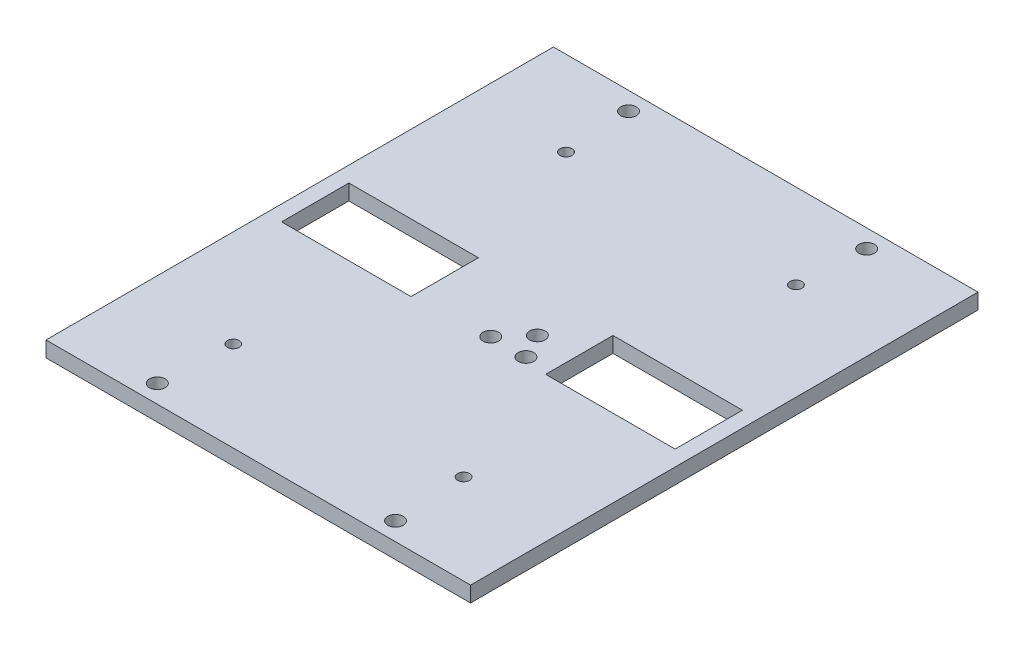
ISO-10303-21;
HEADER;
FILE_DESCRIPTION(('STEP AP214'),'2;1');
FILE_NAME('part.step','',(''),(''),'','','');
FILE_SCHEMA(('AUTOMOTIVE_DESIGN { 1 0 10303 214 1 1 1 1 }'));
ENDSEC;
DATA;
#1=APPLICATION_CONTEXT('core data for automotive mechanical design processes');
#2=APPLICATION_PROTOCOL_DEFINITION('international standard','automotive_design',2000,#1);
#3=PRODUCT_CONTEXT('',#1,'mechanical');
#4=PRODUCT('Part','Part','',(#3));
#5=PRODUCT_RELATED_PRODUCT_CATEGORY('part','',(#4));
#6=PRODUCT_DEFINITION_FORMATION('','',#4);
#7=PRODUCT_DEFINITION_CONTEXT('part definition',#1,'design');
#8=PRODUCT_DEFINITION('design','',#6,#7);
#9=PRODUCT_DEFINITION_SHAPE('','',#8);
#10=(LENGTH_UNIT() NAMED_UNIT(*) SI_UNIT(.MILLI.,.METRE.));
#11=(NAMED_UNIT(*) PLANE_ANGLE_UNIT() SI_UNIT($,.RADIAN.));
#12=(NAMED_UNIT(*) SI_UNIT($,.STERADIAN.) SOLID_ANGLE_UNIT());
#13=UNCERTAINTY_MEASURE_WITH_UNIT(LENGTH_MEASURE(1.E-05),#10,'distance_accuracy_value','');
#14=(GEOMETRIC_REPRESENTATION_CONTEXT(3) GLOBAL_UNCERTAINTY_ASSIGNED_CONTEXT((#13)) GLOBAL_UNIT_ASSIGNED_CONTEXT((#10,
#11,#12)) REPRESENTATION_CONTEXT('',''));
#15=CARTESIAN_POINT('',(0.,0.,0.));
#16=DIRECTION('',(0.,0.,1.));
#17=DIRECTION('',(1.,0.,0.));
#18=AXIS2_PLACEMENT_3D('',#15,#16,#17);
#19=CARTESIAN_POINT('',(-41.,3.,49.));
#20=DIRECTION('',(1.,0.,0.));
#21=DIRECTION('',(0.,0.,-1.));
#22=AXIS2_PLACEMENT_3D('',#19,#20,#21);
#23=PLANE('',#22);
#24=DIRECTION('',(0.,0.,1.));
#25=VECTOR('',#24,1.);
#26=CARTESIAN_POINT('',(-41.,0.,49.));
#27=LINE('',#26,#25);
#28=CARTESIAN_POINT('',(-41.,0.,-49.));
#29=VERTEX_POINT('',#28);
#30=CARTESIAN_POINT('',(-41.,0.,49.));
#31=VERTEX_POINT('',#30);
#32=EDGE_CURVE('E212',#29,#31,#27,.T.);
#33=ORIENTED_EDGE('',*,*,#32,.T.);
#34=DIRECTION('',(0.,-1.,0.));
#35=VECTOR('',#34,1.);
#36=CARTESIAN_POINT('',(-41.,3.,49.));
#37=LINE('',#36,#35);
#38=CARTESIAN_POINT('',(-41.,3.,49.));
#39=VERTEX_POINT('',#38);
#40=EDGE_CURVE('E11',#39,#31,#37,.T.);
#41=ORIENTED_EDGE('',*,*,#40,.F.);
#42=DIRECTION('',(0.,0.,1.));
#43=VECTOR('',#42,1.);
#44=CARTESIAN_POINT('',(-41.,3.,49.));
#45=LINE('',#44,#43);
#46=CARTESIAN_POINT('',(-41.,3.,-49.));
#47=VERTEX_POINT('',#46);
#48=EDGE_CURVE('E213',#47,#39,#45,.T.);
#49=ORIENTED_EDGE('',*,*,#48,.F.);
#50=DIRECTION('',(0.,-1.,0.));
#51=VECTOR('',#50,1.);
#52=CARTESIAN_POINT('',(-41.,3.,-49.));
#53=LINE('',#52,#51);
#54=EDGE_CURVE('E223',#47,#29,#53,.T.);
#55=ORIENTED_EDGE('',*,*,#54,.T.);
#56=EDGE_LOOP('',(#33,#41,#49,#55));
#57=FACE_BOUND('',#56,.T.);
#58=ADVANCED_FACE('F34',(#57),#23,.F.);
#59=CARTESIAN_POINT('',(41.,3.,49.));
#60=DIRECTION('',(0.,0.,-1.));
#61=DIRECTION('',(-1.,0.,0.));
#62=AXIS2_PLACEMENT_3D('',#59,#60,#61);
#63=PLANE('',#62);
#64=DIRECTION('',(1.,0.,0.));
#65=VECTOR('',#64,1.);
#66=CARTESIAN_POINT('',(41.,0.,49.));
#67=LINE('',#66,#65);
#68=CARTESIAN_POINT('',(41.,0.,49.));
#69=VERTEX_POINT('',#68);
#70=EDGE_CURVE('E226',#31,#69,#67,.T.);
#71=ORIENTED_EDGE('',*,*,#70,.T.);
#72=DIRECTION('',(0.,-1.,0.));
#73=VECTOR('',#72,1.);
#74=CARTESIAN_POINT('',(41.,3.,49.));
#75=LINE('',#74,#73);
#76=CARTESIAN_POINT('',(41.,3.,49.));
#77=VERTEX_POINT('',#76);
#78=EDGE_CURVE('E42',#77,#69,#75,.T.);
#79=ORIENTED_EDGE('',*,*,#78,.F.);
#80=DIRECTION('',(1.,0.,0.));
#81=VECTOR('',#80,1.);
#82=CARTESIAN_POINT('',(41.,3.,49.));
#83=LINE('',#82,#81);
#84=EDGE_CURVE('E216',#39,#77,#83,.T.);
#85=ORIENTED_EDGE('',*,*,#84,.F.);
#86=ORIENTED_EDGE('',*,*,#40,.T.);
#87=EDGE_LOOP('',(#71,#79,#85,#86));
#88=FACE_BOUND('',#87,.T.);
#89=ADVANCED_FACE('F280',(#88),#63,.F.);
#90=CARTESIAN_POINT('',(41.,3.,49.));
#91=DIRECTION('',(-1.,0.,0.));
#92=DIRECTION('',(0.,0.,1.));
#93=AXIS2_PLACEMENT_3D('',#90,#91,#92);
#94=PLANE('',#93);
#95=DIRECTION('',(0.,0.,-1.));
#96=VECTOR('',#95,1.);
#97=CARTESIAN_POINT('',(41.,0.,49.));
#98=LINE('',#97,#96);
#99=CARTESIAN_POINT('',(41.,0.,-49.));
#100=VERTEX_POINT('',#99);
#101=EDGE_CURVE('E228',#69,#100,#98,.T.);
#102=ORIENTED_EDGE('',*,*,#101,.T.);
#103=DIRECTION('',(0.,-1.,0.));
#104=VECTOR('',#103,1.);
#105=CARTESIAN_POINT('',(41.,3.,-49.));
#106=LINE('',#105,#104);
#107=CARTESIAN_POINT('',(41.,3.,-49.));
#108=VERTEX_POINT('',#107);
#109=EDGE_CURVE('E233',#108,#100,#106,.T.);
#110=ORIENTED_EDGE('',*,*,#109,.F.);
#111=DIRECTION('',(0.,0.,-1.));
#112=VECTOR('',#111,1.);
#113=CARTESIAN_POINT('',(41.,3.,49.));
#114=LINE('',#113,#112);
#115=EDGE_CURVE('E219',#77,#108,#114,.T.);
#116=ORIENTED_EDGE('',*,*,#115,.F.);
#117=ORIENTED_EDGE('',*,*,#78,.T.);
#118=EDGE_LOOP('',(#102,#110,#116,#117));
#119=FACE_BOUND('',#118,.T.);
#120=ADVANCED_FACE('F285',(#119),#94,.F.);
#121=CARTESIAN_POINT('',(41.,3.,-49.));
#122=DIRECTION('',(0.,0.,1.));
#123=DIRECTION('',(1.,0.,0.));
#124=AXIS2_PLACEMENT_3D('',#121,#122,#123);
#125=PLANE('',#124);
#126=DIRECTION('',(-1.,0.,0.));
#127=VECTOR('',#126,1.);
#128=CARTESIAN_POINT('',(41.,0.,-49.));
#129=LINE('',#128,#127);
#130=EDGE_CURVE('E217',#100,#29,#129,.T.);
#131=ORIENTED_EDGE('',*,*,#130,.T.);
#132=ORIENTED_EDGE('',*,*,#54,.F.);
#133=DIRECTION('',(-1.,0.,0.));
#134=VECTOR('',#133,1.);
#135=CARTESIAN_POINT('',(41.,3.,-49.));
#136=LINE('',#135,#134);
#137=EDGE_CURVE('E221',#108,#47,#136,.T.);
#138=ORIENTED_EDGE('',*,*,#137,.F.);
#139=ORIENTED_EDGE('',*,*,#109,.T.);
#140=EDGE_LOOP('',(#131,#132,#138,#139));
#141=FACE_BOUND('',#140,.T.);
#142=ADVANCED_FACE('F301',(#141),#125,.F.);
#143=CARTESIAN_POINT('',(0.,3.,0.));
#144=DIRECTION('',(0.,1.,0.));
#145=DIRECTION('',(0.,0.,1.));
#146=AXIS2_PLACEMENT_3D('',#143,#144,#145);
#147=PLANE('',#146);
#148=CARTESIAN_POINT('',(1.39999999999996,3.,5.50000000000026));
#149=DIRECTION('',(0.,1.,0.));
#150=DIRECTION('',(0.,0.,1.));
#151=AXIS2_PLACEMENT_3D('',#148,#149,#150);
#152=CIRCLE('',#151,1.5);
#153=CARTESIAN_POINT('',(1.39999999999996,3.,7.00000000000026));
#154=VERTEX_POINT('',#153);
#155=EDGE_CURVE('E476',#154,#154,#152,.T.);
#156=ORIENTED_EDGE('',*,*,#155,.F.);
#157=EDGE_LOOP('',(#156));
#158=FACE_BOUND('',#157,.T.);
#159=CARTESIAN_POINT('',(8.19999999999995,3.,5.50000000000028));
#160=DIRECTION('',(0.,1.,0.));
#161=DIRECTION('',(0.,0.,1.));
#162=AXIS2_PLACEMENT_3D('',#159,#160,#161);
#163=CIRCLE('',#162,1.5);
#164=CARTESIAN_POINT('',(8.19999999999995,3.,7.00000000000028));
#165=VERTEX_POINT('',#164);
#166=EDGE_CURVE('E486',#165,#165,#163,.T.);
#167=ORIENTED_EDGE('',*,*,#166,.F.);
#168=EDGE_LOOP('',(#167));
#169=FACE_BOUND('',#168,.T.);
#170=CARTESIAN_POINT('',(5.69999999999997,3.,0.800000000000266));
#171=DIRECTION('',(0.,1.,0.));
#172=DIRECTION('',(0.,0.,1.));
#173=AXIS2_PLACEMENT_3D('',#170,#171,#172);
#174=CIRCLE('',#173,1.5);
#175=CARTESIAN_POINT('',(5.69999999999997,3.,2.30000000000027));
#176=VERTEX_POINT('',#175);
#177=EDGE_CURVE('E491',#176,#176,#174,.T.);
#178=ORIENTED_EDGE('',*,*,#177,.F.);
#179=EDGE_LOOP('',(#178));
#180=FACE_BOUND('',#179,.T.);
#181=CARTESIAN_POINT('',(-22.2450014404778,3.,31.5907366922285));
#182=DIRECTION('',(0.,1.,0.));
#183=DIRECTION('',(0.,0.,1.));
#184=AXIS2_PLACEMENT_3D('',#181,#182,#183);
#185=CIRCLE('',#184,1.14999999999999);
#186=CARTESIAN_POINT('',(-22.2450014404778,3.,32.7407366922285));
#187=VERTEX_POINT('',#186);
#188=EDGE_CURVE('E254',#187,#187,#185,.T.);
#189=ORIENTED_EDGE('',*,*,#188,.F.);
#190=EDGE_LOOP('',(#189));
#191=FACE_BOUND('',#190,.T.);
#192=CARTESIAN_POINT('',(22.2450014404778,3.,31.5907366922285));
#193=DIRECTION('',(0.,1.,0.));
#194=DIRECTION('',(0.,0.,1.));
#195=AXIS2_PLACEMENT_3D('',#192,#193,#194);
#196=CIRCLE('',#195,1.14999999999999);
#197=CARTESIAN_POINT('',(22.2450014404778,3.,32.7407366922285));
#198=VERTEX_POINT('',#197);
#199=EDGE_CURVE('E244',#198,#198,#196,.T.);
#200=ORIENTED_EDGE('',*,*,#199,.F.);
#201=EDGE_LOOP('',(#200));
#202=FACE_BOUND('',#201,.T.);
#203=CARTESIAN_POINT('',(22.2031172324923,3.,-32.6338065342233));
#204=DIRECTION('',(0.,1.,0.));
#205=DIRECTION('',(0.,0.,1.));
#206=AXIS2_PLACEMENT_3D('',#203,#204,#205);
#207=CIRCLE('',#206,1.14999999999999);
#208=CARTESIAN_POINT('',(22.2031172324923,3.,-31.4838065342233));
#209=VERTEX_POINT('',#208);
#210=EDGE_CURVE('E241',#209,#209,#207,.T.);
#211=ORIENTED_EDGE('',*,*,#210,.F.);
#212=EDGE_LOOP('',(#211));
#213=FACE_BOUND('',#212,.T.);
#214=CARTESIAN_POINT('',(-22.2031172324923,3.,-32.6338065342233));
#215=DIRECTION('',(0.,1.,0.));
#216=DIRECTION('',(0.,0.,1.));
#217=AXIS2_PLACEMENT_3D('',#214,#215,#216);
#218=CIRCLE('',#217,1.14999999999999);
#219=CARTESIAN_POINT('',(-22.2031172324923,3.,-31.4838065342233));
#220=VERTEX_POINT('',#219);
#221=EDGE_CURVE('E240',#220,#220,#218,.T.);
#222=ORIENTED_EDGE('',*,*,#221,.F.);
#223=EDGE_LOOP('',(#222));
#224=FACE_BOUND('',#223,.T.);
#225=DIRECTION('',(0.,0.,1.));
#226=VECTOR('',#225,1.);
#227=CARTESIAN_POINT('',(13.,3.,0.));
#228=LINE('',#227,#226);
#229=CARTESIAN_POINT('',(13.,3.,-6.49999999999975));
#230=VERTEX_POINT('',#229);
#231=CARTESIAN_POINT('',(13.,3.,6.50000000000025));
#232=VERTEX_POINT('',#231);
#233=EDGE_CURVE('E157',#230,#232,#228,.T.);
#234=ORIENTED_EDGE('',*,*,#233,.F.);
#235=DIRECTION('',(-1.,0.,0.));
#236=VECTOR('',#235,1.);
#237=CARTESIAN_POINT('',(0.,3.,-6.49999999999975));
#238=LINE('',#237,#236);
#239=CARTESIAN_POINT('',(38.,3.,-6.49999999999975));
#240=VERTEX_POINT('',#239);
#241=EDGE_CURVE('E150',#240,#230,#238,.T.);
#242=ORIENTED_EDGE('',*,*,#241,.F.);
#243=DIRECTION('',(0.,0.,-1.));
#244=VECTOR('',#243,1.);
#245=CARTESIAN_POINT('',(38.,3.,0.));
#246=LINE('',#245,#244);
#247=CARTESIAN_POINT('',(38.,3.,6.50000000000025));
#248=VERTEX_POINT('',#247);
#249=EDGE_CURVE('E130',#248,#240,#246,.T.);
#250=ORIENTED_EDGE('',*,*,#249,.F.);
#251=DIRECTION('',(1.,0.,0.));
#252=VECTOR('',#251,1.);
#253=CARTESIAN_POINT('',(0.,3.,6.50000000000025));
#254=LINE('',#253,#252);
#255=EDGE_CURVE('E155',#232,#248,#254,.T.);
#256=ORIENTED_EDGE('',*,*,#255,.F.);
#257=EDGE_LOOP('',(#234,#242,#250,#256));
#258=FACE_BOUND('',#257,.T.);
#259=DIRECTION('',(0.,0.,1.));
#260=VECTOR('',#259,1.);
#261=CARTESIAN_POINT('',(-38.,3.,0.));
#262=LINE('',#261,#260);
#263=CARTESIAN_POINT('',(-38.,3.,-6.49999999999975));
#264=VERTEX_POINT('',#263);
#265=CARTESIAN_POINT('',(-38.,3.,6.50000000000025));
#266=VERTEX_POINT('',#265);
#267=EDGE_CURVE('E186',#264,#266,#262,.T.);
#268=ORIENTED_EDGE('',*,*,#267,.F.);
#269=DIRECTION('',(-1.,0.,0.));
#270=VECTOR('',#269,1.);
#271=CARTESIAN_POINT('',(0.,3.,-6.49999999999975));
#272=LINE('',#271,#270);
#273=CARTESIAN_POINT('',(-13.,3.,-6.49999999999975));
#274=VERTEX_POINT('',#273);
#275=EDGE_CURVE('E173',#274,#264,#272,.T.);
#276=ORIENTED_EDGE('',*,*,#275,.F.);
#277=DIRECTION('',(0.,0.,-1.));
#278=VECTOR('',#277,1.);
#279=CARTESIAN_POINT('',(-13.,3.,0.));
#280=LINE('',#279,#278);
#281=CARTESIAN_POINT('',(-13.,3.,6.50000000000025));
#282=VERTEX_POINT('',#281);
#283=EDGE_CURVE('E181',#282,#274,#280,.T.);
#284=ORIENTED_EDGE('',*,*,#283,.F.);
#285=DIRECTION('',(1.,0.,0.));
#286=VECTOR('',#285,1.);
#287=CARTESIAN_POINT('',(0.,3.,6.50000000000025));
#288=LINE('',#287,#286);
#289=EDGE_CURVE('E184',#266,#282,#288,.T.);
#290=ORIENTED_EDGE('',*,*,#289,.F.);
#291=EDGE_LOOP('',(#268,#276,#284,#290));
#292=FACE_BOUND('',#291,.T.);
#293=CARTESIAN_POINT('',(-22.9999999999991,3.,45.5000000000039));
#294=DIRECTION('',(0.,1.,0.));
#295=DIRECTION('',(0.,0.,1.));
#296=AXIS2_PLACEMENT_3D('',#293,#294,#295);
#297=CIRCLE('',#296,1.5);
#298=CARTESIAN_POINT('',(-22.9999999999991,3.,47.0000000000039));
#299=VERTEX_POINT('',#298);
#300=EDGE_CURVE('E191',#299,#299,#297,.T.);
#301=ORIENTED_EDGE('',*,*,#300,.F.);
#302=EDGE_LOOP('',(#301));
#303=FACE_BOUND('',#302,.T.);
#304=CARTESIAN_POINT('',(23.0000000000009,3.,45.5000000000042));
#305=DIRECTION('',(0.,1.,0.));
#306=DIRECTION('',(0.,0.,1.));
#307=AXIS2_PLACEMENT_3D('',#304,#305,#306);
#308=CIRCLE('',#307,1.5);
#309=CARTESIAN_POINT('',(23.0000000000009,3.,47.0000000000042));
#310=VERTEX_POINT('',#309);
#311=EDGE_CURVE('E197',#310,#310,#308,.T.);
#312=ORIENTED_EDGE('',*,*,#311,.F.);
#313=EDGE_LOOP('',(#312));
#314=FACE_BOUND('',#313,.T.);
#315=CARTESIAN_POINT('',(23.0000000000016,3.,-45.4999999999957));
#316=DIRECTION('',(0.,1.,0.));
#317=DIRECTION('',(0.,0.,1.));
#318=AXIS2_PLACEMENT_3D('',#315,#316,#317);
#319=CIRCLE('',#318,1.5);
#320=CARTESIAN_POINT('',(23.0000000000016,3.,-43.9999999999957));
#321=VERTEX_POINT('',#320);
#322=EDGE_CURVE('E203',#321,#321,#319,.T.);
#323=ORIENTED_EDGE('',*,*,#322,.F.);
#324=EDGE_LOOP('',(#323));
#325=FACE_BOUND('',#324,.T.);
#326=CARTESIAN_POINT('',(-22.9999999999984,3.,-45.4999999999961));
#327=DIRECTION('',(0.,1.,0.));
#328=DIRECTION('',(0.,0.,1.));
#329=AXIS2_PLACEMENT_3D('',#326,#327,#328);
#330=CIRCLE('',#329,1.5);
#331=CARTESIAN_POINT('',(-22.9999999999984,3.,-43.9999999999961));
#332=VERTEX_POINT('',#331);
#333=EDGE_CURVE('E209',#332,#332,#330,.T.);
#334=ORIENTED_EDGE('',*,*,#333,.F.);
#335=EDGE_LOOP('',(#334));
#336=FACE_BOUND('',#335,.T.);
#337=ORIENTED_EDGE('',*,*,#48,.T.);
#338=ORIENTED_EDGE('',*,*,#84,.T.);
#339=ORIENTED_EDGE('',*,*,#115,.T.);
#340=ORIENTED_EDGE('',*,*,#137,.T.);
#341=EDGE_LOOP('',(#337,#338,#339,#340));
#342=FACE_BOUND('',#341,.T.);
#343=ADVANCED_FACE('F297',(#158,#169,#180,#191,#202,#213,#224,#258,#292,#303,#314,#325,#336,
#342),#147,.T.);
#344=CARTESIAN_POINT('',(0.,0.,0.));
#345=DIRECTION('',(0.,1.,0.));
#346=DIRECTION('',(0.,0.,1.));
#347=AXIS2_PLACEMENT_3D('',#344,#345,#346);
#348=PLANE('',#347);
#349=CARTESIAN_POINT('',(1.39999999999996,0.,5.50000000000026));
#350=DIRECTION('',(0.,-1.,0.));
#351=DIRECTION('',(0.,0.,-1.));
#352=AXIS2_PLACEMENT_3D('',#349,#350,#351);
#353=CIRCLE('',#352,1.5);
#354=CARTESIAN_POINT('',(1.39999999999996,0.,4.00000000000026));
#355=VERTEX_POINT('',#354);
#356=EDGE_CURVE('E479',#355,#355,#353,.T.);
#357=ORIENTED_EDGE('',*,*,#356,.F.);
#358=EDGE_LOOP('',(#357));
#359=FACE_BOUND('',#358,.T.);
#360=CARTESIAN_POINT('',(8.19999999999995,0.,5.50000000000028));
#361=DIRECTION('',(0.,-1.,0.));
#362=DIRECTION('',(0.,0.,-1.));
#363=AXIS2_PLACEMENT_3D('',#360,#361,#362);
#364=CIRCLE('',#363,1.5);
#365=CARTESIAN_POINT('',(8.19999999999995,0.,4.00000000000028));
#366=VERTEX_POINT('',#365);
#367=EDGE_CURVE('E481',#366,#366,#364,.T.);
#368=ORIENTED_EDGE('',*,*,#367,.F.);
#369=EDGE_LOOP('',(#368));
#370=FACE_BOUND('',#369,.T.);
#371=CARTESIAN_POINT('',(5.69999999999997,0.,0.800000000000266));
#372=DIRECTION('',(0.,-1.,0.));
#373=DIRECTION('',(0.,0.,-1.));
#374=AXIS2_PLACEMENT_3D('',#371,#372,#373);
#375=CIRCLE('',#374,1.5);
#376=CARTESIAN_POINT('',(5.69999999999997,0.,-0.699999999999735));
#377=VERTEX_POINT('',#376);
#378=EDGE_CURVE('E489',#377,#377,#375,.T.);
#379=ORIENTED_EDGE('',*,*,#378,.F.);
#380=EDGE_LOOP('',(#379));
#381=FACE_BOUND('',#380,.T.);
#382=CARTESIAN_POINT('',(-22.2450014404778,0.,31.5907366922285));
#383=DIRECTION('',(0.,1.,0.));
#384=DIRECTION('',(0.,0.,1.));
#385=AXIS2_PLACEMENT_3D('',#382,#383,#384);
#386=CIRCLE('',#385,1.14999999999999);
#387=CARTESIAN_POINT('',(-22.2450014404778,0.,32.7407366922285));
#388=VERTEX_POINT('',#387);
#389=EDGE_CURVE('E37',#388,#388,#386,.T.);
#390=ORIENTED_EDGE('',*,*,#389,.T.);
#391=EDGE_LOOP('',(#390));
#392=FACE_BOUND('',#391,.T.);
#393=CARTESIAN_POINT('',(22.2450014404778,0.,31.5907366922285));
#394=DIRECTION('',(0.,1.,0.));
#395=DIRECTION('',(0.,0.,1.));
#396=AXIS2_PLACEMENT_3D('',#393,#394,#395);
#397=CIRCLE('',#396,1.14999999999999);
#398=CARTESIAN_POINT('',(22.2450014404778,0.,32.7407366922285));
#399=VERTEX_POINT('',#398);
#400=EDGE_CURVE('E242',#399,#399,#397,.T.);
#401=ORIENTED_EDGE('',*,*,#400,.T.);
#402=EDGE_LOOP('',(#401));
#403=FACE_BOUND('',#402,.T.);
#404=CARTESIAN_POINT('',(22.2031172324923,0.,-32.6338065342233));
#405=DIRECTION('',(0.,1.,0.));
#406=DIRECTION('',(0.,0.,1.));
#407=AXIS2_PLACEMENT_3D('',#404,#405,#406);
#408=CIRCLE('',#407,1.14999999999999);
#409=CARTESIAN_POINT('',(22.2031172324923,0.,-31.4838065342233));
#410=VERTEX_POINT('',#409);
#411=EDGE_CURVE('E238',#410,#410,#408,.T.);
#412=ORIENTED_EDGE('',*,*,#411,.T.);
#413=EDGE_LOOP('',(#412));
#414=FACE_BOUND('',#413,.T.);
#415=CARTESIAN_POINT('',(-22.2031172324923,0.,-32.6338065342233));
#416=DIRECTION('',(0.,1.,0.));
#417=DIRECTION('',(0.,0.,1.));
#418=AXIS2_PLACEMENT_3D('',#415,#416,#417);
#419=CIRCLE('',#418,1.14999999999999);
#420=CARTESIAN_POINT('',(-22.2031172324923,0.,-31.4838065342233));
#421=VERTEX_POINT('',#420);
#422=EDGE_CURVE('E260',#421,#421,#419,.T.);
#423=ORIENTED_EDGE('',*,*,#422,.T.);
#424=EDGE_LOOP('',(#423));
#425=FACE_BOUND('',#424,.T.);
#426=DIRECTION('',(1.,0.,0.));
#427=VECTOR('',#426,1.);
#428=CARTESIAN_POINT('',(13.,0.,-6.49999999999975));
#429=LINE('',#428,#427);
#430=CARTESIAN_POINT('',(13.,0.,-6.49999999999975));
#431=VERTEX_POINT('',#430);
#432=CARTESIAN_POINT('',(38.,0.,-6.49999999999975));
#433=VERTEX_POINT('',#432);
#434=EDGE_CURVE('E136',#431,#433,#429,.T.);
#435=ORIENTED_EDGE('',*,*,#434,.F.);
#436=DIRECTION('',(0.,0.,-1.));
#437=VECTOR('',#436,1.);
#438=CARTESIAN_POINT('',(13.,0.,-6.49999999999975));
#439=LINE('',#438,#437);
#440=CARTESIAN_POINT('',(13.,0.,6.50000000000025));
#441=VERTEX_POINT('',#440);
#442=EDGE_CURVE('E58',#441,#431,#439,.T.);
#443=ORIENTED_EDGE('',*,*,#442,.F.);
#444=DIRECTION('',(-1.,0.,0.));
#445=VECTOR('',#444,1.);
#446=CARTESIAN_POINT('',(13.,0.,6.50000000000025));
#447=LINE('',#446,#445);
#448=CARTESIAN_POINT('',(38.,0.,6.50000000000025));
#449=VERTEX_POINT('',#448);
#450=EDGE_CURVE('E143',#449,#441,#447,.T.);
#451=ORIENTED_EDGE('',*,*,#450,.F.);
#452=DIRECTION('',(0.,0.,1.));
#453=VECTOR('',#452,1.);
#454=CARTESIAN_POINT('',(38.,0.,-6.49999999999975));
#455=LINE('',#454,#453);
#456=EDGE_CURVE('E127',#433,#449,#455,.T.);
#457=ORIENTED_EDGE('',*,*,#456,.F.);
#458=EDGE_LOOP('',(#435,#443,#451,#457));
#459=FACE_BOUND('',#458,.T.);
#460=DIRECTION('',(1.,0.,0.));
#461=VECTOR('',#460,1.);
#462=CARTESIAN_POINT('',(-38.,0.,-6.49999999999975));
#463=LINE('',#462,#461);
#464=CARTESIAN_POINT('',(-38.,0.,-6.49999999999975));
#465=VERTEX_POINT('',#464);
#466=CARTESIAN_POINT('',(-13.,0.,-6.49999999999975));
#467=VERTEX_POINT('',#466);
#468=EDGE_CURVE('E161',#465,#467,#463,.T.);
#469=ORIENTED_EDGE('',*,*,#468,.F.);
#470=DIRECTION('',(0.,0.,-1.));
#471=VECTOR('',#470,1.);
#472=CARTESIAN_POINT('',(-38.,0.,-6.49999999999975));
#473=LINE('',#472,#471);
#474=CARTESIAN_POINT('',(-38.,0.,6.50000000000025));
#475=VERTEX_POINT('',#474);
#476=EDGE_CURVE('E159',#475,#465,#473,.T.);
#477=ORIENTED_EDGE('',*,*,#476,.F.);
#478=DIRECTION('',(-1.,0.,0.));
#479=VECTOR('',#478,1.);
#480=CARTESIAN_POINT('',(-38.,0.,6.50000000000025));
#481=LINE('',#480,#479);
#482=CARTESIAN_POINT('',(-13.,0.,6.50000000000025));
#483=VERTEX_POINT('',#482);
#484=EDGE_CURVE('E167',#483,#475,#481,.T.);
#485=ORIENTED_EDGE('',*,*,#484,.F.);
#486=DIRECTION('',(0.,0.,1.));
#487=VECTOR('',#486,1.);
#488=CARTESIAN_POINT('',(-13.,0.,-6.49999999999975));
#489=LINE('',#488,#487);
#490=EDGE_CURVE('E164',#467,#483,#489,.T.);
#491=ORIENTED_EDGE('',*,*,#490,.F.);
#492=EDGE_LOOP('',(#469,#477,#485,#491));
#493=FACE_BOUND('',#492,.T.);
#494=CARTESIAN_POINT('',(-22.9999999999991,0.,45.5000000000039));
#495=DIRECTION('',(0.,-1.,0.));
#496=DIRECTION('',(0.,0.,-1.));
#497=AXIS2_PLACEMENT_3D('',#494,#495,#496);
#498=CIRCLE('',#497,1.5);
#499=CARTESIAN_POINT('',(-22.9999999999991,0.,44.0000000000039));
#500=VERTEX_POINT('',#499);
#501=EDGE_CURVE('E188',#500,#500,#498,.T.);
#502=ORIENTED_EDGE('',*,*,#501,.F.);
#503=EDGE_LOOP('',(#502));
#504=FACE_BOUND('',#503,.T.);
#505=CARTESIAN_POINT('',(23.0000000000009,0.,45.5000000000042));
#506=DIRECTION('',(0.,-1.,0.));
#507=DIRECTION('',(0.,0.,-1.));
#508=AXIS2_PLACEMENT_3D('',#505,#506,#507);
#509=CIRCLE('',#508,1.5);
#510=CARTESIAN_POINT('',(23.0000000000009,0.,44.0000000000042));
#511=VERTEX_POINT('',#510);
#512=EDGE_CURVE('E194',#511,#511,#509,.T.);
#513=ORIENTED_EDGE('',*,*,#512,.F.);
#514=EDGE_LOOP('',(#513));
#515=FACE_BOUND('',#514,.T.);
#516=CARTESIAN_POINT('',(23.0000000000016,0.,-45.4999999999957));
#517=DIRECTION('',(0.,-1.,0.));
#518=DIRECTION('',(0.,0.,-1.));
#519=AXIS2_PLACEMENT_3D('',#516,#517,#518);
#520=CIRCLE('',#519,1.5);
#521=CARTESIAN_POINT('',(23.0000000000016,0.,-46.9999999999957));
#522=VERTEX_POINT('',#521);
#523=EDGE_CURVE('E200',#522,#522,#520,.T.);
#524=ORIENTED_EDGE('',*,*,#523,.F.);
#525=EDGE_LOOP('',(#524));
#526=FACE_BOUND('',#525,.T.);
#527=CARTESIAN_POINT('',(-22.9999999999984,0.,-45.4999999999961));
#528=DIRECTION('',(0.,-1.,0.));
#529=DIRECTION('',(0.,0.,-1.));
#530=AXIS2_PLACEMENT_3D('',#527,#528,#529);
#531=CIRCLE('',#530,1.5);
#532=CARTESIAN_POINT('',(-22.9999999999984,0.,-46.9999999999961));
#533=VERTEX_POINT('',#532);
#534=EDGE_CURVE('E206',#533,#533,#531,.T.);
#535=ORIENTED_EDGE('',*,*,#534,.F.);
#536=EDGE_LOOP('',(#535));
#537=FACE_BOUND('',#536,.T.);
#538=ORIENTED_EDGE('',*,*,#32,.F.);
#539=ORIENTED_EDGE('',*,*,#130,.F.);
#540=ORIENTED_EDGE('',*,*,#101,.F.);
#541=ORIENTED_EDGE('',*,*,#70,.F.);
#542=EDGE_LOOP('',(#538,#539,#540,#541));
#543=FACE_BOUND('',#542,.T.);
#544=ADVANCED_FACE('F140',(#359,#370,#381,#392,#403,#414,#425,#459,#493,#504,#515,#526,#537,
#543),#348,.F.);
#545=CARTESIAN_POINT('',(-22.9999999999984,0.,-45.4999999999961));
#546=DIRECTION('',(0.,-1.,0.));
#547=DIRECTION('',(0.,0.,-1.));
#548=AXIS2_PLACEMENT_3D('',#545,#546,#547);
#549=CYLINDRICAL_SURFACE('',#548,1.5);
#550=ORIENTED_EDGE('',*,*,#333,.T.);
#551=EDGE_LOOP('',(#550));
#552=FACE_BOUND('',#551,.T.);
#553=ORIENTED_EDGE('',*,*,#534,.T.);
#554=EDGE_LOOP('',(#553));
#555=FACE_BOUND('',#554,.T.);
#556=ADVANCED_FACE('F312',(#552,#555),#549,.F.);
#557=CARTESIAN_POINT('',(23.0000000000016,0.,-45.4999999999957));
#558=DIRECTION('',(0.,-1.,0.));
#559=DIRECTION('',(0.,0.,-1.));
#560=AXIS2_PLACEMENT_3D('',#557,#558,#559);
#561=CYLINDRICAL_SURFACE('',#560,1.5);
#562=ORIENTED_EDGE('',*,*,#322,.T.);
#563=EDGE_LOOP('',(#562));
#564=FACE_BOUND('',#563,.T.);
#565=ORIENTED_EDGE('',*,*,#523,.T.);
#566=EDGE_LOOP('',(#565));
#567=FACE_BOUND('',#566,.T.);
#568=ADVANCED_FACE('F319',(#564,#567),#561,.F.);
#569=CARTESIAN_POINT('',(23.0000000000009,0.,45.5000000000042));
#570=DIRECTION('',(0.,-1.,0.));
#571=DIRECTION('',(0.,0.,-1.));
#572=AXIS2_PLACEMENT_3D('',#569,#570,#571);
#573=CYLINDRICAL_SURFACE('',#572,1.5);
#574=ORIENTED_EDGE('',*,*,#311,.T.);
#575=EDGE_LOOP('',(#574));
#576=FACE_BOUND('',#575,.T.);
#577=ORIENTED_EDGE('',*,*,#512,.T.);
#578=EDGE_LOOP('',(#577));
#579=FACE_BOUND('',#578,.T.);
#580=ADVANCED_FACE('F323',(#576,#579),#573,.F.);
#581=CARTESIAN_POINT('',(-22.9999999999991,0.,45.5000000000039));
#582=DIRECTION('',(0.,-1.,0.));
#583=DIRECTION('',(0.,0.,-1.));
#584=AXIS2_PLACEMENT_3D('',#581,#582,#583);
#585=CYLINDRICAL_SURFACE('',#584,1.5);
#586=ORIENTED_EDGE('',*,*,#300,.T.);
#587=EDGE_LOOP('',(#586));
#588=FACE_BOUND('',#587,.T.);
#589=ORIENTED_EDGE('',*,*,#501,.T.);
#590=EDGE_LOOP('',(#589));
#591=FACE_BOUND('',#590,.T.);
#592=ADVANCED_FACE('F327',(#588,#591),#585,.F.);
#593=CARTESIAN_POINT('',(-38.,10.,-6.49999999999975));
#594=DIRECTION('',(-1.,0.,0.));
#595=DIRECTION('',(0.,0.,1.));
#596=AXIS2_PLACEMENT_3D('',#593,#594,#595);
#597=PLANE('',#596);
#598=ORIENTED_EDGE('',*,*,#267,.T.);
#599=DIRECTION('',(0.,-1.,0.));
#600=VECTOR('',#599,1.);
#601=CARTESIAN_POINT('',(-38.,10.,6.50000000000025));
#602=LINE('',#601,#600);
#603=EDGE_CURVE('E171',#266,#475,#602,.T.);
#604=ORIENTED_EDGE('',*,*,#603,.T.);
#605=ORIENTED_EDGE('',*,*,#476,.T.);
#606=DIRECTION('',(0.,-1.,0.));
#607=VECTOR('',#606,1.);
#608=CARTESIAN_POINT('',(-38.,10.,-6.49999999999975));
#609=LINE('',#608,#607);
#610=EDGE_CURVE('E170',#264,#465,#609,.T.);
#611=ORIENTED_EDGE('',*,*,#610,.F.);
#612=EDGE_LOOP('',(#598,#604,#605,#611));
#613=FACE_BOUND('',#612,.T.);
#614=ADVANCED_FACE('F331',(#613),#597,.F.);
#615=CARTESIAN_POINT('',(-38.,10.,6.50000000000025));
#616=DIRECTION('',(0.,0.,1.));
#617=DIRECTION('',(1.,0.,0.));
#618=AXIS2_PLACEMENT_3D('',#615,#616,#617);
#619=PLANE('',#618);
#620=ORIENTED_EDGE('',*,*,#289,.T.);
#621=DIRECTION('',(0.,-1.,0.));
#622=VECTOR('',#621,1.);
#623=CARTESIAN_POINT('',(-13.,10.,6.50000000000025));
#624=LINE('',#623,#622);
#625=EDGE_CURVE('E174',#282,#483,#624,.T.);
#626=ORIENTED_EDGE('',*,*,#625,.T.);
#627=ORIENTED_EDGE('',*,*,#484,.T.);
#628=ORIENTED_EDGE('',*,*,#603,.F.);
#629=EDGE_LOOP('',(#620,#626,#627,#628));
#630=FACE_BOUND('',#629,.T.);
#631=ADVANCED_FACE('F335',(#630),#619,.F.);
#632=CARTESIAN_POINT('',(-13.,10.,-6.49999999999975));
#633=DIRECTION('',(1.,0.,0.));
#634=DIRECTION('',(0.,0.,-1.));
#635=AXIS2_PLACEMENT_3D('',#632,#633,#634);
#636=PLANE('',#635);
#637=ORIENTED_EDGE('',*,*,#283,.T.);
#638=DIRECTION('',(0.,-1.,0.));
#639=VECTOR('',#638,1.);
#640=CARTESIAN_POINT('',(-13.,10.,-6.49999999999975));
#641=LINE('',#640,#639);
#642=EDGE_CURVE('E176',#274,#467,#641,.T.);
#643=ORIENTED_EDGE('',*,*,#642,.T.);
#644=ORIENTED_EDGE('',*,*,#490,.T.);
#645=ORIENTED_EDGE('',*,*,#625,.F.);
#646=EDGE_LOOP('',(#637,#643,#644,#645));
#647=FACE_BOUND('',#646,.T.);
#648=ADVANCED_FACE('F341',(#647),#636,.F.);
#649=CARTESIAN_POINT('',(-38.,10.,-6.49999999999975));
#650=DIRECTION('',(0.,0.,-1.));
#651=DIRECTION('',(-1.,0.,0.));
#652=AXIS2_PLACEMENT_3D('',#649,#650,#651);
#653=PLANE('',#652);
#654=ORIENTED_EDGE('',*,*,#275,.T.);
#655=ORIENTED_EDGE('',*,*,#610,.T.);
#656=ORIENTED_EDGE('',*,*,#468,.T.);
#657=ORIENTED_EDGE('',*,*,#642,.F.);
#658=EDGE_LOOP('',(#654,#655,#656,#657));
#659=FACE_BOUND('',#658,.T.);
#660=ADVANCED_FACE('F337',(#659),#653,.F.);
#661=CARTESIAN_POINT('',(13.,10.,-6.49999999999975));
#662=DIRECTION('',(-1.,0.,0.));
#663=DIRECTION('',(0.,0.,1.));
#664=AXIS2_PLACEMENT_3D('',#661,#662,#663);
#665=PLANE('',#664);
#666=ORIENTED_EDGE('',*,*,#233,.T.);
#667=DIRECTION('',(0.,-1.,0.));
#668=VECTOR('',#667,1.);
#669=CARTESIAN_POINT('',(13.,10.,6.50000000000025));
#670=LINE('',#669,#668);
#671=EDGE_CURVE('E148',#232,#441,#670,.T.);
#672=ORIENTED_EDGE('',*,*,#671,.T.);
#673=ORIENTED_EDGE('',*,*,#442,.T.);
#674=DIRECTION('',(0.,-1.,0.));
#675=VECTOR('',#674,1.);
#676=CARTESIAN_POINT('',(13.,10.,-6.49999999999975));
#677=LINE('',#676,#675);
#678=EDGE_CURVE('E133',#230,#431,#677,.T.);
#679=ORIENTED_EDGE('',*,*,#678,.F.);
#680=EDGE_LOOP('',(#666,#672,#673,#679));
#681=FACE_BOUND('',#680,.T.);
#682=ADVANCED_FACE('F340',(#681),#665,.F.);
#683=CARTESIAN_POINT('',(13.,10.,6.50000000000025));
#684=DIRECTION('',(0.,0.,1.));
#685=DIRECTION('',(1.,0.,0.));
#686=AXIS2_PLACEMENT_3D('',#683,#684,#685);
#687=PLANE('',#686);
#688=ORIENTED_EDGE('',*,*,#255,.T.);
#689=DIRECTION('',(0.,-1.,0.));
#690=VECTOR('',#689,1.);
#691=CARTESIAN_POINT('',(38.,10.,6.50000000000025));
#692=LINE('',#691,#690);
#693=EDGE_CURVE('E132',#248,#449,#692,.T.);
#694=ORIENTED_EDGE('',*,*,#693,.T.);
#695=ORIENTED_EDGE('',*,*,#450,.T.);
#696=ORIENTED_EDGE('',*,*,#671,.F.);
#697=EDGE_LOOP('',(#688,#694,#695,#696));
#698=FACE_BOUND('',#697,.T.);
#699=ADVANCED_FACE('F350',(#698),#687,.F.);
#700=CARTESIAN_POINT('',(38.,10.,-6.49999999999975));
#701=DIRECTION('',(1.,0.,0.));
#702=DIRECTION('',(0.,0.,-1.));
#703=AXIS2_PLACEMENT_3D('',#700,#701,#702);
#704=PLANE('',#703);
#705=ORIENTED_EDGE('',*,*,#249,.T.);
#706=DIRECTION('',(0.,-1.,0.));
#707=VECTOR('',#706,1.);
#708=CARTESIAN_POINT('',(38.,10.,-6.49999999999975));
#709=LINE('',#708,#707);
#710=EDGE_CURVE('E50',#240,#433,#709,.T.);
#711=ORIENTED_EDGE('',*,*,#710,.T.);
#712=ORIENTED_EDGE('',*,*,#456,.T.);
#713=ORIENTED_EDGE('',*,*,#693,.F.);
#714=EDGE_LOOP('',(#705,#711,#712,#713));
#715=FACE_BOUND('',#714,.T.);
#716=ADVANCED_FACE('F124',(#715),#704,.F.);
#717=CARTESIAN_POINT('',(13.,10.,-6.49999999999975));
#718=DIRECTION('',(0.,0.,-1.));
#719=DIRECTION('',(-1.,0.,0.));
#720=AXIS2_PLACEMENT_3D('',#717,#718,#719);
#721=PLANE('',#720);
#722=ORIENTED_EDGE('',*,*,#241,.T.);
#723=ORIENTED_EDGE('',*,*,#678,.T.);
#724=ORIENTED_EDGE('',*,*,#434,.T.);
#725=ORIENTED_EDGE('',*,*,#710,.F.);
#726=EDGE_LOOP('',(#722,#723,#724,#725));
#727=FACE_BOUND('',#726,.T.);
#728=ADVANCED_FACE('F137',(#727),#721,.F.);
#729=CARTESIAN_POINT('',(-22.2031172324923,3.,-32.6338065342233));
#730=DIRECTION('',(0.,1.,0.));
#731=DIRECTION('',(0.,0.,1.));
#732=AXIS2_PLACEMENT_3D('',#729,#730,#731);
#733=CYLINDRICAL_SURFACE('',#732,1.14999999999999);
#734=ORIENTED_EDGE('',*,*,#221,.T.);
#735=EDGE_LOOP('',(#734));
#736=FACE_BOUND('',#735,.T.);
#737=ORIENTED_EDGE('',*,*,#422,.F.);
#738=EDGE_LOOP('',(#737));
#739=FACE_BOUND('',#738,.T.);
#740=ADVANCED_FACE('F265',(#736,#739),#733,.F.);
#741=CARTESIAN_POINT('',(22.2031172324923,3.,-32.6338065342233));
#742=DIRECTION('',(0.,1.,0.));
#743=DIRECTION('',(0.,0.,1.));
#744=AXIS2_PLACEMENT_3D('',#741,#742,#743);
#745=CYLINDRICAL_SURFACE('',#744,1.14999999999999);
#746=ORIENTED_EDGE('',*,*,#210,.T.);
#747=EDGE_LOOP('',(#746));
#748=FACE_BOUND('',#747,.T.);
#749=ORIENTED_EDGE('',*,*,#411,.F.);
#750=EDGE_LOOP('',(#749));
#751=FACE_BOUND('',#750,.T.);
#752=ADVANCED_FACE('F267',(#748,#751),#745,.F.);
#753=CARTESIAN_POINT('',(22.2450014404778,3.,31.5907366922285));
#754=DIRECTION('',(0.,1.,0.));
#755=DIRECTION('',(0.,0.,1.));
#756=AXIS2_PLACEMENT_3D('',#753,#754,#755);
#757=CYLINDRICAL_SURFACE('',#756,1.14999999999999);
#758=ORIENTED_EDGE('',*,*,#199,.T.);
#759=EDGE_LOOP('',(#758));
#760=FACE_BOUND('',#759,.T.);
#761=ORIENTED_EDGE('',*,*,#400,.F.);
#762=EDGE_LOOP('',(#761));
#763=FACE_BOUND('',#762,.T.);
#764=ADVANCED_FACE('F274',(#760,#763),#757,.F.);
#765=CARTESIAN_POINT('',(-22.2450014404778,3.,31.5907366922285));
#766=DIRECTION('',(0.,1.,0.));
#767=DIRECTION('',(0.,0.,1.));
#768=AXIS2_PLACEMENT_3D('',#765,#766,#767);
#769=CYLINDRICAL_SURFACE('',#768,1.14999999999999);
#770=ORIENTED_EDGE('',*,*,#188,.T.);
#771=EDGE_LOOP('',(#770));
#772=FACE_BOUND('',#771,.T.);
#773=ORIENTED_EDGE('',*,*,#389,.F.);
#774=EDGE_LOOP('',(#773));
#775=FACE_BOUND('',#774,.T.);
#776=ADVANCED_FACE('F422',(#772,#775),#769,.F.);
#777=CARTESIAN_POINT('',(5.69999999999997,10.,0.800000000000266));
#778=DIRECTION('',(0.,-1.,0.));
#779=DIRECTION('',(0.,0.,-1.));
#780=AXIS2_PLACEMENT_3D('',#777,#778,#779);
#781=CYLINDRICAL_SURFACE('',#780,1.5);
#782=ORIENTED_EDGE('',*,*,#177,.T.);
#783=EDGE_LOOP('',(#782));
#784=FACE_BOUND('',#783,.T.);
#785=ORIENTED_EDGE('',*,*,#378,.T.);
#786=EDGE_LOOP('',(#785));
#787=FACE_BOUND('',#786,.T.);
#788=ADVANCED_FACE('F431',(#784,#787),#781,.F.);
#789=CARTESIAN_POINT('',(8.19999999999995,0.,5.50000000000028));
#790=DIRECTION('',(0.,-1.,0.));
#791=DIRECTION('',(0.,0.,-1.));
#792=AXIS2_PLACEMENT_3D('',#789,#790,#791);
#793=CYLINDRICAL_SURFACE('',#792,1.5);
#794=ORIENTED_EDGE('',*,*,#166,.T.);
#795=EDGE_LOOP('',(#794));
#796=FACE_BOUND('',#795,.T.);
#797=ORIENTED_EDGE('',*,*,#367,.T.);
#798=EDGE_LOOP('',(#797));
#799=FACE_BOUND('',#798,.T.);
#800=ADVANCED_FACE('F440',(#796,#799),#793,.F.);
#801=CARTESIAN_POINT('',(1.39999999999996,0.,5.50000000000026));
#802=DIRECTION('',(0.,-1.,0.));
#803=DIRECTION('',(0.,0.,-1.));
#804=AXIS2_PLACEMENT_3D('',#801,#802,#803);
#805=CYLINDRICAL_SURFACE('',#804,1.5);
#806=ORIENTED_EDGE('',*,*,#155,.T.);
#807=EDGE_LOOP('',(#806));
#808=FACE_BOUND('',#807,.T.);
#809=ORIENTED_EDGE('',*,*,#356,.T.);
#810=EDGE_LOOP('',(#809));
#811=FACE_BOUND('',#810,.T.);
#812=ADVANCED_FACE('F459',(#808,#811),#805,.F.);
#813=CLOSED_SHELL('',(#58,#89,#120,#142,#343,#544,#556,#568,#580,#592,#614,#631,#648,#660,#682,
#699,#716,#728,#740,#752,#764,#776,#788,#800,#812));
#814=MANIFOLD_SOLID_BREP('B2',#813);
#815=ADVANCED_BREP_SHAPE_REPRESENTATION('',(#18,#814),#14);
#816=SHAPE_DEFINITION_REPRESENTATION(#9,#815);
ENDSEC;
END-ISO-10303-21;
